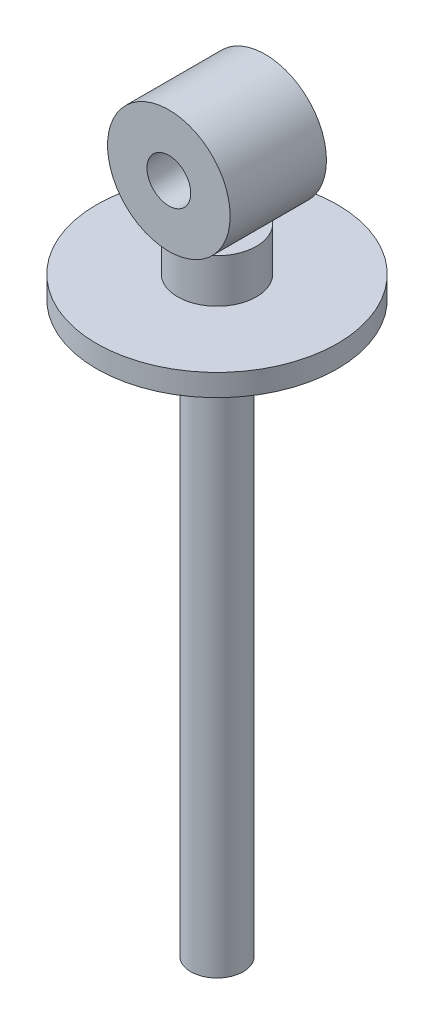
ISO-10303-21;
HEADER;
FILE_DESCRIPTION(('STEP AP214'),'2;1');
FILE_NAME('part.step','',(''),(''),'','','');
FILE_SCHEMA(('AUTOMOTIVE_DESIGN { 1 0 10303 214 1 1 1 1 }'));
ENDSEC;
DATA;
#1=APPLICATION_CONTEXT('core data for automotive mechanical design processes');
#2=APPLICATION_PROTOCOL_DEFINITION('international standard','automotive_design',2000,#1);
#3=PRODUCT_CONTEXT('',#1,'mechanical');
#4=PRODUCT('Part','Part','',(#3));
#5=PRODUCT_RELATED_PRODUCT_CATEGORY('part','',(#4));
#6=PRODUCT_DEFINITION_FORMATION('','',#4);
#7=PRODUCT_DEFINITION_CONTEXT('part definition',#1,'design');
#8=PRODUCT_DEFINITION('design','',#6,#7);
#9=PRODUCT_DEFINITION_SHAPE('','',#8);
#10=(LENGTH_UNIT() NAMED_UNIT(*) SI_UNIT(.MILLI.,.METRE.));
#11=(NAMED_UNIT(*) PLANE_ANGLE_UNIT() SI_UNIT($,.RADIAN.));
#12=(NAMED_UNIT(*) SI_UNIT($,.STERADIAN.) SOLID_ANGLE_UNIT());
#13=UNCERTAINTY_MEASURE_WITH_UNIT(LENGTH_MEASURE(1.E-05),#10,'distance_accuracy_value','');
#14=(GEOMETRIC_REPRESENTATION_CONTEXT(3) GLOBAL_UNCERTAINTY_ASSIGNED_CONTEXT((#13)) GLOBAL_UNIT_ASSIGNED_CONTEXT((#10,
#11,#12)) REPRESENTATION_CONTEXT('',''));
#15=CARTESIAN_POINT('',(0.,0.,0.));
#16=DIRECTION('',(0.,0.,1.));
#17=DIRECTION('',(1.,0.,0.));
#18=AXIS2_PLACEMENT_3D('',#15,#16,#17);
#19=CARTESIAN_POINT('',(0.,29.,11.));
#20=DIRECTION('',(0.,0.,1.));
#21=DIRECTION('',(1.,0.,0.));
#22=AXIS2_PLACEMENT_3D('',#19,#20,#21);
#23=PLANE('',#22);
#24=CARTESIAN_POINT('',(0.,29.,11.));
#25=DIRECTION('',(0.,0.,1.));
#26=DIRECTION('',(1.,0.,0.));
#27=AXIS2_PLACEMENT_3D('',#24,#25,#26);
#28=CIRCLE('',#27,14.);
#29=CARTESIAN_POINT('',(14.,29.,11.));
#30=VERTEX_POINT('',#29);
#31=EDGE_CURVE('E13',#30,#30,#28,.T.);
#32=ORIENTED_EDGE('',*,*,#31,.T.);
#33=EDGE_LOOP('',(#32));
#34=FACE_BOUND('',#33,.T.);
#35=CARTESIAN_POINT('',(0.,29.,11.));
#36=DIRECTION('',(0.,0.,1.));
#37=DIRECTION('',(1.,0.,0.));
#38=AXIS2_PLACEMENT_3D('',#35,#36,#37);
#39=CIRCLE('',#38,5.);
#40=CARTESIAN_POINT('',(5.,29.,11.));
#41=VERTEX_POINT('',#40);
#42=EDGE_CURVE('E65',#41,#41,#39,.T.);
#43=ORIENTED_EDGE('',*,*,#42,.F.);
#44=EDGE_LOOP('',(#43));
#45=FACE_BOUND('',#44,.T.);
#46=ADVANCED_FACE('F54',(#34,#45),#23,.T.);
#47=CARTESIAN_POINT('',(0.,29.,-11.));
#48=DIRECTION('',(0.,0.,1.));
#49=DIRECTION('',(1.,0.,0.));
#50=AXIS2_PLACEMENT_3D('',#47,#48,#49);
#51=PLANE('',#50);
#52=CARTESIAN_POINT('',(0.,29.,-11.));
#53=DIRECTION('',(0.,0.,1.));
#54=DIRECTION('',(1.,0.,0.));
#55=AXIS2_PLACEMENT_3D('',#52,#53,#54);
#56=CIRCLE('',#55,14.);
#57=CARTESIAN_POINT('',(14.,29.,-11.));
#58=VERTEX_POINT('',#57);
#59=EDGE_CURVE('E58',#58,#58,#56,.T.);
#60=ORIENTED_EDGE('',*,*,#59,.F.);
#61=EDGE_LOOP('',(#60));
#62=FACE_BOUND('',#61,.T.);
#63=CARTESIAN_POINT('',(0.,29.,-11.));
#64=DIRECTION('',(0.,0.,1.));
#65=DIRECTION('',(1.,0.,0.));
#66=AXIS2_PLACEMENT_3D('',#63,#64,#65);
#67=CIRCLE('',#66,5.);
#68=CARTESIAN_POINT('',(5.,29.,-11.));
#69=VERTEX_POINT('',#68);
#70=EDGE_CURVE('E67',#69,#69,#67,.T.);
#71=ORIENTED_EDGE('',*,*,#70,.T.);
#72=EDGE_LOOP('',(#71));
#73=FACE_BOUND('',#72,.T.);
#74=ADVANCED_FACE('F77',(#62,#73),#51,.F.);
#75=CARTESIAN_POINT('',(0.,29.,11.));
#76=DIRECTION('',(0.,0.,-1.));
#77=DIRECTION('',(-1.,0.,0.));
#78=AXIS2_PLACEMENT_3D('',#75,#76,#77);
#79=CYLINDRICAL_SURFACE('',#78,14.);
#80=ORIENTED_EDGE('',*,*,#31,.F.);
#81=EDGE_LOOP('',(#80));
#82=FACE_BOUND('',#81,.T.);
#83=ORIENTED_EDGE('',*,*,#59,.T.);
#84=EDGE_LOOP('',(#83));
#85=FACE_BOUND('',#84,.T.);
#86=ADVANCED_FACE('F56',(#82,#85),#79,.T.);
#87=CARTESIAN_POINT('',(0.,29.,11.));
#88=DIRECTION('',(0.,0.,-1.));
#89=DIRECTION('',(-1.,0.,0.));
#90=AXIS2_PLACEMENT_3D('',#87,#88,#89);
#91=CYLINDRICAL_SURFACE('',#90,5.);
#92=ORIENTED_EDGE('',*,*,#42,.T.);
#93=EDGE_LOOP('',(#92));
#94=FACE_BOUND('',#93,.T.);
#95=ORIENTED_EDGE('',*,*,#70,.F.);
#96=EDGE_LOOP('',(#95));
#97=FACE_BOUND('',#96,.T.);
#98=ADVANCED_FACE('F73',(#94,#97),#91,.F.);
#99=CLOSED_SHELL('',(#46,#74,#86,#98));
#100=MANIFOLD_SOLID_BREP('B2',#99);
#101=CARTESIAN_POINT('',(0.,5.,0.));
#102=DIRECTION('',(0.,-1.,0.));
#103=DIRECTION('',(0.,0.,-1.));
#104=AXIS2_PLACEMENT_3D('',#101,#102,#103);
#105=CYLINDRICAL_SURFACE('',#104,27.5);
#106=CARTESIAN_POINT('',(0.,5.,0.));
#107=DIRECTION('',(0.,1.,0.));
#108=DIRECTION('',(0.,0.,1.));
#109=AXIS2_PLACEMENT_3D('',#106,#107,#108);
#110=CIRCLE('',#109,27.5);
#111=CARTESIAN_POINT('',(0.,5.,27.5));
#112=VERTEX_POINT('',#111);
#113=EDGE_CURVE('E127',#112,#112,#110,.T.);
#114=ORIENTED_EDGE('',*,*,#113,.F.);
#115=EDGE_LOOP('',(#114));
#116=FACE_BOUND('',#115,.T.);
#117=CARTESIAN_POINT('',(0.,0.,0.));
#118=DIRECTION('',(0.,1.,0.));
#119=DIRECTION('',(0.,0.,1.));
#120=AXIS2_PLACEMENT_3D('',#117,#118,#119);
#121=CIRCLE('',#120,27.5);
#122=CARTESIAN_POINT('',(0.,0.,27.5));
#123=VERTEX_POINT('',#122);
#124=EDGE_CURVE('E131',#123,#123,#121,.T.);
#125=ORIENTED_EDGE('',*,*,#124,.T.);
#126=EDGE_LOOP('',(#125));
#127=FACE_BOUND('',#126,.T.);
#128=ADVANCED_FACE('F121',(#116,#127),#105,.T.);
#129=CARTESIAN_POINT('',(0.,5.,0.));
#130=DIRECTION('',(0.,1.,0.));
#131=DIRECTION('',(0.,0.,1.));
#132=AXIS2_PLACEMENT_3D('',#129,#130,#131);
#133=PLANE('',#132);
#134=CARTESIAN_POINT('',(0.,5.,0.));
#135=DIRECTION('',(0.,1.,0.));
#136=DIRECTION('',(0.,0.,1.));
#137=AXIS2_PLACEMENT_3D('',#134,#135,#136);
#138=CIRCLE('',#137,9.);
#139=CARTESIAN_POINT('',(0.,5.,9.));
#140=VERTEX_POINT('',#139);
#141=EDGE_CURVE('E138',#140,#140,#138,.T.);
#142=ORIENTED_EDGE('',*,*,#141,.F.);
#143=EDGE_LOOP('',(#142));
#144=FACE_BOUND('',#143,.T.);
#145=ORIENTED_EDGE('',*,*,#113,.T.);
#146=EDGE_LOOP('',(#145));
#147=FACE_BOUND('',#146,.T.);
#148=ADVANCED_FACE('F162',(#144,#147),#133,.T.);
#149=CARTESIAN_POINT('',(0.,0.,0.));
#150=DIRECTION('',(0.,1.,0.));
#151=DIRECTION('',(0.,0.,1.));
#152=AXIS2_PLACEMENT_3D('',#149,#150,#151);
#153=PLANE('',#152);
#154=CARTESIAN_POINT('',(0.,0.,0.));
#155=DIRECTION('',(0.,1.,0.));
#156=DIRECTION('',(0.,0.,1.));
#157=AXIS2_PLACEMENT_3D('',#154,#155,#156);
#158=CIRCLE('',#157,6.);
#159=CARTESIAN_POINT('',(0.,0.,6.));
#160=VERTEX_POINT('',#159);
#161=EDGE_CURVE('E53',#160,#160,#158,.F.);
#162=ORIENTED_EDGE('',*,*,#161,.F.);
#163=EDGE_LOOP('',(#162));
#164=FACE_BOUND('',#163,.T.);
#165=ORIENTED_EDGE('',*,*,#124,.F.);
#166=EDGE_LOOP('',(#165));
#167=FACE_BOUND('',#166,.T.);
#168=ADVANCED_FACE('F167',(#164,#167),#153,.F.);
#169=CARTESIAN_POINT('',(0.,15.,0.));
#170=DIRECTION('',(0.,-1.,0.));
#171=DIRECTION('',(0.,0.,-1.));
#172=AXIS2_PLACEMENT_3D('',#169,#170,#171);
#173=CYLINDRICAL_SURFACE('',#172,9.);
#174=CARTESIAN_POINT('',(0.,15.,0.));
#175=DIRECTION('',(0.,1.,0.));
#176=DIRECTION('',(0.,0.,1.));
#177=AXIS2_PLACEMENT_3D('',#174,#175,#176);
#178=CIRCLE('',#177,9.);
#179=CARTESIAN_POINT('',(0.,15.,9.));
#180=VERTEX_POINT('',#179);
#181=EDGE_CURVE('E136',#180,#180,#178,.T.);
#182=ORIENTED_EDGE('',*,*,#181,.F.);
#183=EDGE_LOOP('',(#182));
#184=FACE_BOUND('',#183,.T.);
#185=ORIENTED_EDGE('',*,*,#141,.T.);
#186=EDGE_LOOP('',(#185));
#187=FACE_BOUND('',#186,.T.);
#188=ADVANCED_FACE('F158',(#184,#187),#173,.T.);
#189=CARTESIAN_POINT('',(0.,15.,0.));
#190=DIRECTION('',(0.,1.,0.));
#191=DIRECTION('',(0.,0.,1.));
#192=AXIS2_PLACEMENT_3D('',#189,#190,#191);
#193=PLANE('',#192);
#194=ORIENTED_EDGE('',*,*,#181,.T.);
#195=EDGE_LOOP('',(#194));
#196=FACE_BOUND('',#195,.T.);
#197=ADVANCED_FACE('F151',(#196),#193,.T.);
#198=CARTESIAN_POINT('',(0.,-130.,0.));
#199=DIRECTION('',(0.,1.,0.));
#200=DIRECTION('',(0.,0.,1.));
#201=AXIS2_PLACEMENT_3D('',#198,#199,#200);
#202=CYLINDRICAL_SURFACE('',#201,6.);
#203=CARTESIAN_POINT('',(0.,-130.,0.));
#204=DIRECTION('',(0.,-1.,0.));
#205=DIRECTION('',(0.,0.,-1.));
#206=AXIS2_PLACEMENT_3D('',#203,#204,#205);
#207=CIRCLE('',#206,6.);
#208=CARTESIAN_POINT('',(0.,-130.,-6.));
#209=VERTEX_POINT('',#208);
#210=EDGE_CURVE('E141',#209,#209,#207,.T.);
#211=ORIENTED_EDGE('',*,*,#210,.F.);
#212=EDGE_LOOP('',(#211));
#213=FACE_BOUND('',#212,.T.);
#214=ORIENTED_EDGE('',*,*,#161,.T.);
#215=EDGE_LOOP('',(#214));
#216=FACE_BOUND('',#215,.T.);
#217=ADVANCED_FACE('F149',(#213,#216),#202,.T.);
#218=CARTESIAN_POINT('',(0.,-130.,0.));
#219=DIRECTION('',(0.,-1.,0.));
#220=DIRECTION('',(0.,0.,-1.));
#221=AXIS2_PLACEMENT_3D('',#218,#219,#220);
#222=PLANE('',#221);
#223=ORIENTED_EDGE('',*,*,#210,.T.);
#224=EDGE_LOOP('',(#223));
#225=FACE_BOUND('',#224,.T.);
#226=ADVANCED_FACE('F147',(#225),#222,.T.);
#227=CLOSED_SHELL('',(#128,#148,#168,#188,#197,#217,#226));
#228=MANIFOLD_SOLID_BREP('B8',#227);
#229=ADVANCED_BREP_SHAPE_REPRESENTATION('',(#18,#100,#228),#14);
#230=SHAPE_DEFINITION_REPRESENTATION(#9,#229);
ENDSEC;
END-ISO-10303-21;
